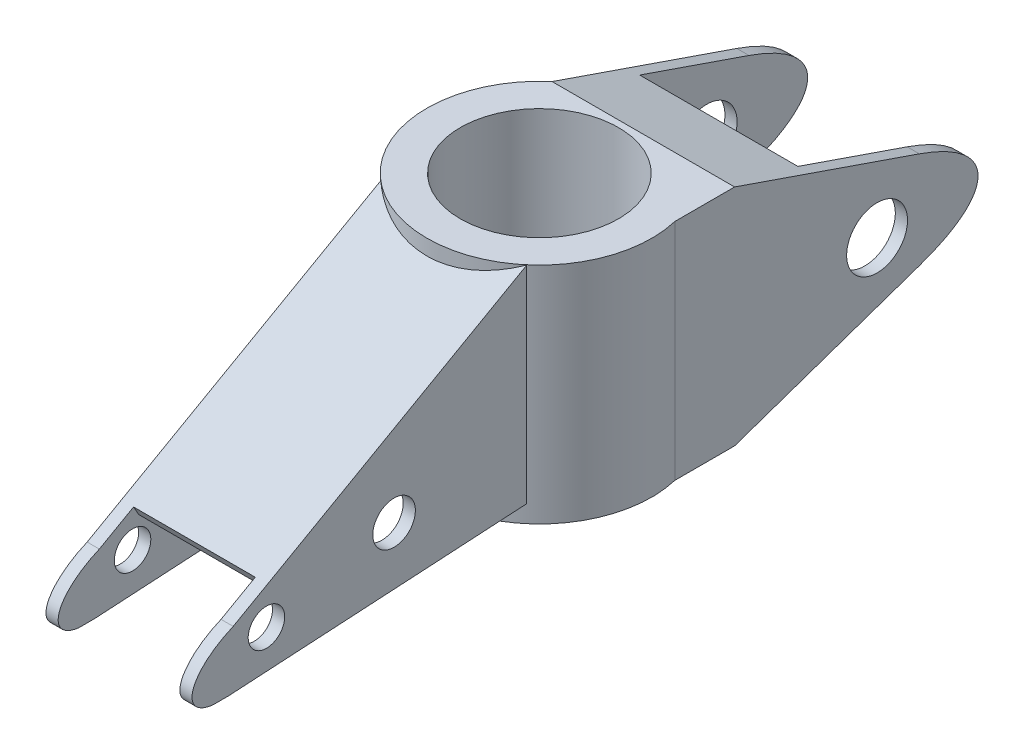
ISO-10303-21;
HEADER;
FILE_DESCRIPTION(('STEP AP214'),'2;1');
FILE_NAME('part.step','',(''),(''),'','','');
FILE_SCHEMA(('AUTOMOTIVE_DESIGN { 1 0 10303 214 1 1 1 1 }'));
ENDSEC;
DATA;
#1=APPLICATION_CONTEXT('core data for automotive mechanical design processes');
#2=APPLICATION_PROTOCOL_DEFINITION('international standard','automotive_design',2000,#1);
#3=PRODUCT_CONTEXT('',#1,'mechanical');
#4=PRODUCT('Part','Part','',(#3));
#5=PRODUCT_RELATED_PRODUCT_CATEGORY('part','',(#4));
#6=PRODUCT_DEFINITION_FORMATION('','',#4);
#7=PRODUCT_DEFINITION_CONTEXT('part definition',#1,'design');
#8=PRODUCT_DEFINITION('design','',#6,#7);
#9=PRODUCT_DEFINITION_SHAPE('','',#8);
#10=(LENGTH_UNIT() NAMED_UNIT(*) SI_UNIT(.MILLI.,.METRE.));
#11=(NAMED_UNIT(*) PLANE_ANGLE_UNIT() SI_UNIT($,.RADIAN.));
#12=(NAMED_UNIT(*) SI_UNIT($,.STERADIAN.) SOLID_ANGLE_UNIT());
#13=UNCERTAINTY_MEASURE_WITH_UNIT(LENGTH_MEASURE(1.E-05),#10,'distance_accuracy_value','');
#14=(GEOMETRIC_REPRESENTATION_CONTEXT(3) GLOBAL_UNCERTAINTY_ASSIGNED_CONTEXT((#13)) GLOBAL_UNIT_ASSIGNED_CONTEXT((#10,
#11,#12)) REPRESENTATION_CONTEXT('',''));
#15=CARTESIAN_POINT('',(0.,0.,0.));
#16=DIRECTION('',(0.,0.,1.));
#17=DIRECTION('',(1.,0.,0.));
#18=AXIS2_PLACEMENT_3D('',#15,#16,#17);
#19=CARTESIAN_POINT('',(4.00000000000001,-100.079968025574,0.));
#20=DIRECTION('',(-1.,0.,0.));
#21=DIRECTION('',(0.,0.,1.));
#22=AXIS2_PLACEMENT_3D('',#19,#20,#21);
#23=PLANE('',#22);
#24=CARTESIAN_POINT('',(4.,35.8147805236539,-103.144942625602));
#25=DIRECTION('',(-1.,0.,0.));
#26=DIRECTION('',(0.,0.,1.));
#27=AXIS2_PLACEMENT_3D('',#24,#25,#26);
#28=CIRCLE('',#27,9.99999999999999);
#29=CARTESIAN_POINT('',(4.,35.8147805236539,-93.1449426256023));
#30=VERTEX_POINT('',#29);
#31=EDGE_CURVE('E298',#30,#30,#28,.T.);
#32=ORIENTED_EDGE('',*,*,#31,.T.);
#33=EDGE_LOOP('',(#32));
#34=FACE_BOUND('',#33,.T.);
#35=DIRECTION('',(0.,-0.945410692070635,0.32588130249912));
#36=VECTOR('',#35,1.);
#37=CARTESIAN_POINT('',(4.,65.1499902046389,-81.1248515178503));
#38=LINE('',#37,#36);
#39=CARTESIAN_POINT('',(4.00000000000001,65.1499902046389,-81.1248515178503));
#40=VERTEX_POINT('',#39);
#41=CARTESIAN_POINT('',(4.,61.3683474363564,-79.8213263078538));
#42=VERTEX_POINT('',#41);
#43=EDGE_CURVE('E297',#40,#42,#38,.T.);
#44=ORIENTED_EDGE('',*,*,#43,.T.);
#45=DIRECTION('',(0.,0.325881302499121,0.945410692070635));
#46=VECTOR('',#45,1.);
#47=CARTESIAN_POINT('',(4.,61.3683474363564,-79.8213263078538));
#48=LINE('',#47,#46);
#49=CARTESIAN_POINT('',(4.00000000000001,68.4457949539171,-59.2890205132042));
#50=VERTEX_POINT('',#49);
#51=EDGE_CURVE('E274',#42,#50,#48,.T.);
#52=ORIENTED_EDGE('',*,*,#51,.T.);
#53=DIRECTION('',(0.,1.,0.));
#54=VECTOR('',#53,1.);
#55=CARTESIAN_POINT('',(4.,-100.079968025574,-59.2890205132042));
#56=LINE('',#55,#54);
#57=CARTESIAN_POINT('',(4.00000000000001,1.02323956880528,-59.2890205132042));
#58=VERTEX_POINT('',#57);
#59=EDGE_CURVE('E466',#58,#50,#56,.T.);
#60=ORIENTED_EDGE('',*,*,#59,.F.);
#61=DIRECTION('',(0.,0.325881302499121,-0.945410692070635));
#62=VECTOR('',#61,1.);
#63=CARTESIAN_POINT('',(4.00000000000002,-27.9802350987114,24.8526434840547));
#64=LINE('',#63,#62);
#65=CARTESIAN_POINT('',(4.,20.9264446672444,-117.029991726457));
#66=VERTEX_POINT('',#65);
#67=EDGE_CURVE('E458',#58,#66,#64,.T.);
#68=ORIENTED_EDGE('',*,*,#67,.T.);
#69=CARTESIAN_POINT('',(4.00000000000002,36.85,-68.1602556806574));
#70=DIRECTION('',(-1.,0.,0.));
#71=DIRECTION('',(0.,0.,-1.));
#72=AXIS2_PLACEMENT_3D('',#69,#70,#71);
#73=ELLIPSE('',#72,68.1602556806574,22.8428717685278);
#74=CARTESIAN_POINT('',(4.,52.7735553327556,-117.029991726457));
#75=VERTEX_POINT('',#74);
#76=EDGE_CURVE('E474',#75,#66,#73,.T.);
#77=ORIENTED_EDGE('',*,*,#76,.F.);
#78=DIRECTION('',(0.,-0.325881302499121,-0.945410692070635));
#79=VECTOR('',#78,1.);
#80=CARTESIAN_POINT('',(4.00000000000001,72.5966869079805,-59.5213209379844));
#81=LINE('',#80,#79);
#82=EDGE_CURVE('E476',#40,#75,#81,.T.);
#83=ORIENTED_EDGE('',*,*,#82,.F.);
#84=EDGE_LOOP('',(#44,#52,#60,#68,#77,#83));
#85=FACE_BOUND('',#84,.T.);
#86=ADVANCED_FACE('F92',(#34,#85),#23,.F.);
#87=CARTESIAN_POINT('',(56.,-100.079968025574,0.));
#88=DIRECTION('',(-1.,0.,0.));
#89=DIRECTION('',(0.,0.,1.));
#90=AXIS2_PLACEMENT_3D('',#87,#88,#89);
#91=PLANE('',#90);
#92=DIRECTION('',(0.,1.,0.));
#93=VECTOR('',#92,1.);
#94=CARTESIAN_POINT('',(56.,68.7,-58.244155034346));
#95=LINE('',#94,#93);
#96=CARTESIAN_POINT('',(56.,68.7,-58.244155034346));
#97=VERTEX_POINT('',#96);
#98=CARTESIAN_POINT('',(56.,68.8059581359527,-58.244155034346));
#99=VERTEX_POINT('',#98);
#100=EDGE_CURVE('E276',#97,#99,#95,.T.);
#101=ORIENTED_EDGE('',*,*,#100,.T.);
#102=DIRECTION('',(0.,0.325881302499121,0.945410692070635));
#103=VECTOR('',#102,1.);
#104=CARTESIAN_POINT('',(56.,61.3683474363564,-79.8213263078538));
#105=LINE('',#104,#103);
#106=CARTESIAN_POINT('',(56.,61.3683474363564,-79.8213263078538));
#107=VERTEX_POINT('',#106);
#108=EDGE_CURVE('E266',#107,#99,#105,.T.);
#109=ORIENTED_EDGE('',*,*,#108,.F.);
#110=DIRECTION('',(0.,-0.945410692070635,0.32588130249912));
#111=VECTOR('',#110,1.);
#112=CARTESIAN_POINT('',(56.,65.1499902046389,-81.1248515178503));
#113=LINE('',#112,#111);
#114=CARTESIAN_POINT('',(56.,65.1499902046389,-81.1248515178503));
#115=VERTEX_POINT('',#114);
#116=EDGE_CURVE('E288',#115,#107,#113,.T.);
#117=ORIENTED_EDGE('',*,*,#116,.F.);
#118=DIRECTION('',(0.,-0.325881302499121,-0.945410692070635));
#119=VECTOR('',#118,1.);
#120=CARTESIAN_POINT('',(56.,72.5966869079805,-59.5213209379844));
#121=LINE('',#120,#119);
#122=CARTESIAN_POINT('',(56.,52.7735553327556,-117.029991726457));
#123=VERTEX_POINT('',#122);
#124=EDGE_CURVE('E311',#115,#123,#121,.T.);
#125=ORIENTED_EDGE('',*,*,#124,.T.);
#126=CARTESIAN_POINT('',(56.,36.85,-68.1602556806574));
#127=DIRECTION('',(-1.,0.,0.));
#128=DIRECTION('',(0.,0.,-1.));
#129=AXIS2_PLACEMENT_3D('',#126,#127,#128);
#130=ELLIPSE('',#129,68.1602556806574,22.8428717685278);
#131=CARTESIAN_POINT('',(56.,20.9264446672444,-117.029991726457));
#132=VERTEX_POINT('',#131);
#133=EDGE_CURVE('E308',#123,#132,#130,.T.);
#134=ORIENTED_EDGE('',*,*,#133,.T.);
#135=DIRECTION('',(0.,0.325881302499121,-0.945410692070635));
#136=VECTOR('',#135,1.);
#137=CARTESIAN_POINT('',(56.,-27.9802350987114,24.8526434840547));
#138=LINE('',#137,#136);
#139=CARTESIAN_POINT('',(56.,0.,-56.3205113613149));
#140=VERTEX_POINT('',#139);
#141=EDGE_CURVE('E100',#140,#132,#138,.T.);
#142=ORIENTED_EDGE('',*,*,#141,.F.);
#143=DIRECTION('',(0.,0.,-1.));
#144=VECTOR('',#143,1.);
#145=CARTESIAN_POINT('',(56.,0.,0.));
#146=LINE('',#145,#144);
#147=CARTESIAN_POINT('',(56.,0.,-46.7344313016641));
#148=VERTEX_POINT('',#147);
#149=EDGE_CURVE('E457',#148,#140,#146,.T.);
#150=ORIENTED_EDGE('',*,*,#149,.F.);
#151=DIRECTION('',(0.,1.,0.));
#152=VECTOR('',#151,1.);
#153=CARTESIAN_POINT('',(56.,-100.079968025574,-46.7344313016641));
#154=LINE('',#153,#152);
#155=CARTESIAN_POINT('',(56.,68.7,-46.7344313016641));
#156=VERTEX_POINT('',#155);
#157=EDGE_CURVE('E313',#148,#156,#154,.T.);
#158=ORIENTED_EDGE('',*,*,#157,.T.);
#159=DIRECTION('',(0.,0.,-1.));
#160=VECTOR('',#159,1.);
#161=CARTESIAN_POINT('',(56.,68.7,-56.3205113613149));
#162=LINE('',#161,#160);
#163=EDGE_CURVE('E107',#156,#97,#162,.T.);
#164=ORIENTED_EDGE('',*,*,#163,.T.);
#165=EDGE_LOOP('',(#101,#109,#117,#125,#134,#142,#150,#158,#164));
#166=FACE_BOUND('',#165,.T.);
#167=CARTESIAN_POINT('',(56.,35.8147805236539,-103.144942625602));
#168=DIRECTION('',(-1.,0.,0.));
#169=DIRECTION('',(0.,0.,1.));
#170=AXIS2_PLACEMENT_3D('',#167,#168,#169);
#171=CIRCLE('',#170,9.99999999999999);
#172=CARTESIAN_POINT('',(56.,35.8147805236539,-93.1449426256023));
#173=VERTEX_POINT('',#172);
#174=EDGE_CURVE('E296',#173,#173,#171,.T.);
#175=ORIENTED_EDGE('',*,*,#174,.F.);
#176=EDGE_LOOP('',(#175));
#177=FACE_BOUND('',#176,.T.);
#178=ADVANCED_FACE('F277',(#166,#177),#91,.T.);
#179=CARTESIAN_POINT('',(24.,73.7,-28.1602556806574));
#180=DIRECTION('',(0.,-1.,0.));
#181=DIRECTION('',(0.,0.,-1.));
#182=AXIS2_PLACEMENT_3D('',#179,#180,#181);
#183=CYLINDRICAL_SURFACE('',#182,37.);
#184=CARTESIAN_POINT('',(24.,79.1758221409391,-28.1602556806574));
#185=DIRECTION('',(0.,0.945410692070635,-0.325881302499121));
#186=DIRECTION('',(0.,-0.325881302499121,-0.945410692070635));
#187=AXIS2_PLACEMENT_3D('',#184,#185,#186);
#188=ELLIPSE('',#187,39.136430664818,37.);
#189=CARTESIAN_POINT('',(45.5397075114109,68.8059581359527,-58.244155034346));
#190=VERTEX_POINT('',#189);
#191=EDGE_CURVE('E13',#190,#50,#188,.T.);
#192=ORIENTED_EDGE('',*,*,#191,.F.);
#193=DIRECTION('',(0.,1.,0.));
#194=VECTOR('',#193,1.);
#195=CARTESIAN_POINT('',(45.5397075114109,68.7,-58.244155034346));
#196=LINE('',#195,#194);
#197=CARTESIAN_POINT('',(45.5397075114109,68.7,-58.244155034346));
#198=VERTEX_POINT('',#197);
#199=EDGE_CURVE('E115',#198,#190,#196,.T.);
#200=ORIENTED_EDGE('',*,*,#199,.F.);
#201=CARTESIAN_POINT('',(24.,68.7,-28.1602556806574));
#202=DIRECTION('',(0.,-1.,0.));
#203=DIRECTION('',(0.,0.,1.));
#204=AXIS2_PLACEMENT_3D('',#201,#202,#203);
#205=CIRCLE('',#204,37.);
#206=EDGE_CURVE('E916',#198,#156,#205,.T.);
#207=ORIENTED_EDGE('',*,*,#206,.T.);
#208=ORIENTED_EDGE('',*,*,#157,.F.);
#209=CARTESIAN_POINT('',(24.,0.,-28.1602556806574));
#210=DIRECTION('',(0.,1.,0.));
#211=DIRECTION('',(0.,0.,1.));
#212=AXIS2_PLACEMENT_3D('',#209,#210,#211);
#213=CIRCLE('',#212,37.);
#214=CARTESIAN_POINT('',(48.,0.,-56.3205113613149));
#215=VERTEX_POINT('',#214);
#216=EDGE_CURVE('E310',#148,#215,#213,.T.);
#217=ORIENTED_EDGE('',*,*,#216,.T.);
#218=CARTESIAN_POINT('',(24.,-9.70678761821669,-28.1602556806574));
#219=DIRECTION('',(0.,0.945410692070635,0.325881302499121));
#220=DIRECTION('',(0.,-0.325881302499121,0.945410692070635));
#221=AXIS2_PLACEMENT_3D('',#218,#219,#220);
#222=ELLIPSE('',#221,39.136430664818,37.);
#223=EDGE_CURVE('E470',#215,#58,#222,.T.);
#224=ORIENTED_EDGE('',*,*,#223,.T.);
#225=ORIENTED_EDGE('',*,*,#59,.T.);
#226=EDGE_LOOP('',(#192,#200,#207,#208,#217,#224,#225));
#227=FACE_BOUND('',#226,.T.);
#228=ADVANCED_FACE('F517',(#227),#183,.T.);
#229=CARTESIAN_POINT('',(0.,-100.079968025574,0.));
#230=DIRECTION('',(1.,0.,0.));
#231=DIRECTION('',(0.,0.,-1.));
#232=AXIS2_PLACEMENT_3D('',#229,#230,#231);
#233=PLANE('',#232);
#234=CARTESIAN_POINT('',(0.,35.8147805236539,-103.144942625602));
#235=DIRECTION('',(1.,0.,0.));
#236=DIRECTION('',(0.,0.,-1.));
#237=AXIS2_PLACEMENT_3D('',#234,#235,#236);
#238=CIRCLE('',#237,9.99999999999999);
#239=CARTESIAN_POINT('',(0.,35.8147805236539,-113.144942625602));
#240=VERTEX_POINT('',#239);
#241=EDGE_CURVE('E301',#240,#240,#238,.T.);
#242=ORIENTED_EDGE('',*,*,#241,.T.);
#243=EDGE_LOOP('',(#242));
#244=FACE_BOUND('',#243,.T.);
#245=CARTESIAN_POINT('',(0.,36.85,-68.1602556806574));
#246=DIRECTION('',(-1.,0.,0.));
#247=DIRECTION('',(0.,0.,-1.));
#248=AXIS2_PLACEMENT_3D('',#245,#246,#247);
#249=ELLIPSE('',#248,68.1602556806574,22.8428717685278);
#250=CARTESIAN_POINT('',(0.,52.7735553327556,-117.029991726457));
#251=VERTEX_POINT('',#250);
#252=CARTESIAN_POINT('',(0.,20.9264446672444,-117.029991726457));
#253=VERTEX_POINT('',#252);
#254=EDGE_CURVE('E304',#251,#253,#249,.T.);
#255=ORIENTED_EDGE('',*,*,#254,.T.);
#256=DIRECTION('',(0.,0.325881302499121,-0.945410692070635));
#257=VECTOR('',#256,1.);
#258=CARTESIAN_POINT('',(0.,-17.3518802726336,-5.9811607711669));
#259=LINE('',#258,#257);
#260=CARTESIAN_POINT('',(0.,0.,-56.3205113613149));
#261=VERTEX_POINT('',#260);
#262=EDGE_CURVE('E858',#261,#253,#259,.T.);
#263=ORIENTED_EDGE('',*,*,#262,.F.);
#264=DIRECTION('',(0.,1.,0.));
#265=VECTOR('',#264,1.);
#266=CARTESIAN_POINT('',(0.,-100.079968025574,-56.3205113613149));
#267=LINE('',#266,#265);
#268=CARTESIAN_POINT('',(0.,73.7,-56.3205113613149));
#269=VERTEX_POINT('',#268);
#270=EDGE_CURVE('E462',#261,#269,#267,.T.);
#271=ORIENTED_EDGE('',*,*,#270,.T.);
#272=DIRECTION('',(0.,-0.325881302499121,-0.945410692070635));
#273=VECTOR('',#272,1.);
#274=CARTESIAN_POINT('',(0.,83.2250417340584,-28.6875166827628));
#275=LINE('',#274,#273);
#276=EDGE_CURVE('E465',#269,#251,#275,.T.);
#277=ORIENTED_EDGE('',*,*,#276,.T.);
#278=EDGE_LOOP('',(#255,#263,#271,#277));
#279=FACE_BOUND('',#278,.T.);
#280=ADVANCED_FACE('F498',(#244,#279),#233,.F.);
#281=CARTESIAN_POINT('',(24.,0.,-28.1602556806574));
#282=DIRECTION('',(0.,1.,0.));
#283=DIRECTION('',(0.,0.,1.));
#284=AXIS2_PLACEMENT_3D('',#281,#282,#283);
#285=PLANE('',#284);
#286=CARTESIAN_POINT('',(24.,0.,-28.1602556806574));
#287=DIRECTION('',(0.,1.,0.));
#288=DIRECTION('',(0.,0.,1.));
#289=AXIS2_PLACEMENT_3D('',#286,#287,#288);
#290=CIRCLE('',#289,26.);
#291=CARTESIAN_POINT('',(24.,0.,-2.16025568065744));
#292=VERTEX_POINT('',#291);
#293=EDGE_CURVE('E454',#292,#292,#290,.T.);
#294=ORIENTED_EDGE('',*,*,#293,.T.);
#295=EDGE_LOOP('',(#294));
#296=FACE_BOUND('',#295,.T.);
#297=CARTESIAN_POINT('',(60.,0.,-36.7042594259749));
#298=VERTEX_POINT('',#297);
#299=EDGE_CURVE('E446',#261,#298,#213,.T.);
#300=ORIENTED_EDGE('',*,*,#299,.F.);
#301=DIRECTION('',(-1.,0.,0.));
#302=VECTOR('',#301,1.);
#303=CARTESIAN_POINT('',(76.,0.,-56.3205113613149));
#304=LINE('',#303,#302);
#305=EDGE_CURVE('E887',#215,#261,#304,.T.);
#306=ORIENTED_EDGE('',*,*,#305,.F.);
#307=ORIENTED_EDGE('',*,*,#216,.F.);
#308=ORIENTED_EDGE('',*,*,#149,.T.);
#309=CARTESIAN_POINT('',(60.,0.,-56.3205113613149));
#310=VERTEX_POINT('',#309);
#311=EDGE_CURVE('E307',#310,#140,#304,.T.);
#312=ORIENTED_EDGE('',*,*,#311,.F.);
#313=DIRECTION('',(0.,0.,1.));
#314=VECTOR('',#313,1.);
#315=CARTESIAN_POINT('',(60.,0.,0.));
#316=LINE('',#315,#314);
#317=EDGE_CURVE('E868',#310,#298,#316,.T.);
#318=ORIENTED_EDGE('',*,*,#317,.T.);
#319=EDGE_LOOP('',(#300,#306,#307,#308,#312,#318));
#320=FACE_BOUND('',#319,.T.);
#321=ADVANCED_FACE('F94',(#296,#320),#285,.F.);
#322=CARTESIAN_POINT('',(60.,-100.079968025574,0.));
#323=DIRECTION('',(1.,0.,0.));
#324=DIRECTION('',(0.,0.,-1.));
#325=AXIS2_PLACEMENT_3D('',#322,#323,#324);
#326=PLANE('',#325);
#327=CARTESIAN_POINT('',(60.,35.8147805236539,-103.144942625602));
#328=DIRECTION('',(1.,0.,0.));
#329=DIRECTION('',(0.,0.,-1.));
#330=AXIS2_PLACEMENT_3D('',#327,#328,#329);
#331=CIRCLE('',#330,9.99999999999999);
#332=CARTESIAN_POINT('',(60.,35.8147805236539,-113.144942625602));
#333=VERTEX_POINT('',#332);
#334=EDGE_CURVE('E293',#333,#333,#331,.T.);
#335=ORIENTED_EDGE('',*,*,#334,.F.);
#336=EDGE_LOOP('',(#335));
#337=FACE_BOUND('',#336,.T.);
#338=DIRECTION('',(0.,-0.325881302499121,0.945410692070635));
#339=VECTOR('',#338,1.);
#340=CARTESIAN_POINT('',(60.,-27.9802350987114,24.8526434840547));
#341=LINE('',#340,#339);
#342=CARTESIAN_POINT('',(60.,20.9264446672444,-117.029991726457));
#343=VERTEX_POINT('',#342);
#344=EDGE_CURVE('E890',#343,#310,#341,.T.);
#345=ORIENTED_EDGE('',*,*,#344,.F.);
#346=CARTESIAN_POINT('',(60.,36.85,-68.1602556806574));
#347=DIRECTION('',(-1.,0.,0.));
#348=DIRECTION('',(0.,0.,-1.));
#349=AXIS2_PLACEMENT_3D('',#346,#347,#348);
#350=ELLIPSE('',#349,68.1602556806574,22.8428717685278);
#351=CARTESIAN_POINT('',(60.,52.7735553327556,-117.029991726457));
#352=VERTEX_POINT('',#351);
#353=EDGE_CURVE('E480',#343,#352,#350,.F.);
#354=ORIENTED_EDGE('',*,*,#353,.T.);
#355=DIRECTION('',(0.,0.325881302499121,0.945410692070635));
#356=VECTOR('',#355,1.);
#357=CARTESIAN_POINT('',(60.,72.5966869079805,-59.5213209379844));
#358=LINE('',#357,#356);
#359=CARTESIAN_POINT('',(60.,73.7,-56.3205113613149));
#360=VERTEX_POINT('',#359);
#361=EDGE_CURVE('E472',#352,#360,#358,.T.);
#362=ORIENTED_EDGE('',*,*,#361,.T.);
#363=DIRECTION('',(0.,0.,-1.));
#364=VECTOR('',#363,1.);
#365=CARTESIAN_POINT('',(60.,73.7,0.));
#366=LINE('',#365,#364);
#367=CARTESIAN_POINT('',(60.,73.7,-36.7042594259749));
#368=VERTEX_POINT('',#367);
#369=EDGE_CURVE('E469',#368,#360,#366,.T.);
#370=ORIENTED_EDGE('',*,*,#369,.F.);
#371=DIRECTION('',(0.,1.,0.));
#372=VECTOR('',#371,1.);
#373=CARTESIAN_POINT('',(60.,-100.079968025574,-36.7042594259749));
#374=LINE('',#373,#372);
#375=EDGE_CURVE('E421',#298,#368,#374,.T.);
#376=ORIENTED_EDGE('',*,*,#375,.F.);
#377=ORIENTED_EDGE('',*,*,#317,.F.);
#378=EDGE_LOOP('',(#345,#354,#362,#370,#376,#377));
#379=FACE_BOUND('',#378,.T.);
#380=ADVANCED_FACE('F514',(#337,#379),#326,.T.);
#381=CARTESIAN_POINT('',(24.,73.7,-28.1602556806574));
#382=DIRECTION('',(0.,1.,0.));
#383=DIRECTION('',(0.,0.,1.));
#384=AXIS2_PLACEMENT_3D('',#381,#382,#383);
#385=PLANE('',#384);
#386=DIRECTION('',(-1.,0.,0.));
#387=VECTOR('',#386,1.);
#388=CARTESIAN_POINT('',(76.,73.7,-56.3205113613149));
#389=LINE('',#388,#387);
#390=EDGE_CURVE('E453',#360,#269,#389,.T.);
#391=ORIENTED_EDGE('',*,*,#390,.T.);
#392=CARTESIAN_POINT('',(24.,73.7,-28.1602556806574));
#393=DIRECTION('',(0.,1.,0.));
#394=DIRECTION('',(0.,0.,1.));
#395=AXIS2_PLACEMENT_3D('',#392,#393,#394);
#396=CIRCLE('',#395,37.);
#397=EDGE_CURVE('E440',#269,#368,#396,.T.);
#398=ORIENTED_EDGE('',*,*,#397,.T.);
#399=ORIENTED_EDGE('',*,*,#369,.T.);
#400=EDGE_LOOP('',(#391,#398,#399));
#401=FACE_BOUND('',#400,.T.);
#402=CARTESIAN_POINT('',(24.,73.7,-28.1602556806574));
#403=DIRECTION('',(0.,1.,0.));
#404=DIRECTION('',(0.,0.,1.));
#405=AXIS2_PLACEMENT_3D('',#402,#403,#404);
#406=CIRCLE('',#405,26.);
#407=CARTESIAN_POINT('',(24.,73.7,-2.16025568065744));
#408=VERTEX_POINT('',#407);
#409=EDGE_CURVE('E433',#408,#408,#406,.T.);
#410=ORIENTED_EDGE('',*,*,#409,.F.);
#411=EDGE_LOOP('',(#410));
#412=FACE_BOUND('',#411,.T.);
#413=ADVANCED_FACE('F510',(#401,#412),#385,.T.);
#414=DIRECTION('',(0.,-1.,0.));
#415=VECTOR('',#414,1.);
#416=CARTESIAN_POINT('',(4.,73.7,2.96850915188929));
#417=LINE('',#416,#415);
#418=CARTESIAN_POINT('',(4.,67.9400447519825,2.96850915188933));
#419=VERTEX_POINT('',#418);
#420=CARTESIAN_POINT('',(4.00000000000001,5.53645253708714,2.96850915188922));
#421=VERTEX_POINT('',#420);
#422=EDGE_CURVE('E437',#419,#421,#417,.T.);
#423=ORIENTED_EDGE('',*,*,#422,.T.);
#424=CARTESIAN_POINT('',(24.,7.34868602794372,-28.1602556806574));
#425=DIRECTION('',(0.,0.998309666919394,0.0581189206307865));
#426=DIRECTION('',(0.,-0.0581189206307866,0.998309666919395));
#427=AXIS2_PLACEMENT_3D('',#424,#425,#426);
#428=ELLIPSE('',#427,37.0626482203417,37.);
#429=CARTESIAN_POINT('',(0.,5.70927120599056,0.));
#430=VERTEX_POINT('',#429);
#431=EDGE_CURVE('E434',#421,#430,#428,.F.);
#432=ORIENTED_EDGE('',*,*,#431,.T.);
#433=DIRECTION('',(0.,-1.,0.));
#434=VECTOR('',#433,1.);
#435=CARTESIAN_POINT('',(0.,0.,0.));
#436=LINE('',#435,#434);
#437=CARTESIAN_POINT('',(0.,73.62,0.));
#438=VERTEX_POINT('',#437);
#439=EDGE_CURVE('E329',#438,#430,#436,.T.);
#440=ORIENTED_EDGE('',*,*,#439,.F.);
#441=CARTESIAN_POINT('',(24.,89.5566088819785,-28.1602556806574));
#442=DIRECTION('',(0.,-0.870298697625102,-0.492524290682248));
#443=DIRECTION('',(0.,-0.492524290682248,0.870298697625102));
#444=AXIS2_PLACEMENT_3D('',#441,#442,#443);
#445=ELLIPSE('',#444,42.514139227103,37.);
#446=CARTESIAN_POINT('',(48.,73.62,0.));
#447=VERTEX_POINT('',#446);
#448=EDGE_CURVE('E318',#438,#447,#445,.F.);
#449=ORIENTED_EDGE('',*,*,#448,.T.);
#450=DIRECTION('',(0.,1.,0.));
#451=VECTOR('',#450,1.);
#452=CARTESIAN_POINT('',(48.,73.62,0.));
#453=LINE('',#452,#451);
#454=CARTESIAN_POINT('',(48.,5.70927120599057,0.));
#455=VERTEX_POINT('',#454);
#456=EDGE_CURVE('E569',#455,#447,#453,.T.);
#457=ORIENTED_EDGE('',*,*,#456,.F.);
#458=CARTESIAN_POINT('',(24.,7.34868602794372,-28.1602556806574));
#459=DIRECTION('',(0.,0.998309666919394,0.0581189206307865));
#460=DIRECTION('',(0.,-0.0581189206307866,0.998309666919395));
#461=AXIS2_PLACEMENT_3D('',#458,#459,#460);
#462=ELLIPSE('',#461,37.0626482203417,37.);
#463=CARTESIAN_POINT('',(44.,5.53645253708716,2.96850915188925));
#464=VERTEX_POINT('',#463);
#465=EDGE_CURVE('E314',#455,#464,#462,.F.);
#466=ORIENTED_EDGE('',*,*,#465,.T.);
#467=DIRECTION('',(0.,-1.,0.));
#468=VECTOR('',#467,1.);
#469=CARTESIAN_POINT('',(44.,73.7,2.96850915188929));
#470=LINE('',#469,#468);
#471=CARTESIAN_POINT('',(44.,67.9400447519826,2.96850915188929));
#472=VERTEX_POINT('',#471);
#473=EDGE_CURVE('E317',#464,#472,#470,.F.);
#474=ORIENTED_EDGE('',*,*,#473,.T.);
#475=CARTESIAN_POINT('',(24.,85.5566088819786,-28.1602556806574));
#476=DIRECTION('',(0.,0.870298697625101,0.492524290682249));
#477=DIRECTION('',(0.,-0.492524290682249,0.870298697625101));
#478=AXIS2_PLACEMENT_3D('',#475,#476,#477);
#479=ELLIPSE('',#478,42.514139227103,37.);
#480=EDGE_CURVE('E443',#472,#419,#479,.F.);
#481=ORIENTED_EDGE('',*,*,#480,.T.);
#482=EDGE_LOOP('',(#423,#432,#440,#449,#457,#466,#474,#481));
#483=FACE_BOUND('',#482,.T.);
#484=ORIENTED_EDGE('',*,*,#299,.T.);
#485=ORIENTED_EDGE('',*,*,#375,.T.);
#486=ORIENTED_EDGE('',*,*,#397,.F.);
#487=ORIENTED_EDGE('',*,*,#270,.F.);
#488=EDGE_LOOP('',(#484,#485,#486,#487));
#489=FACE_BOUND('',#488,.T.);
#490=ADVANCED_FACE('F513',(#483,#489),#183,.T.);
#491=CARTESIAN_POINT('',(4.,73.62,110.));
#492=DIRECTION('',(-1.,0.,0.));
#493=DIRECTION('',(0.,-1.,0.));
#494=AXIS2_PLACEMENT_3D('',#491,#492,#493);
#495=PLANE('',#494);
#496=CARTESIAN_POINT('',(4.00000000000001,13.3225136906807,85.5494254000948));
#497=DIRECTION('',(-1.,0.,0.));
#498=DIRECTION('',(0.,-1.,0.));
#499=AXIS2_PLACEMENT_3D('',#496,#497,#498);
#500=CIRCLE('',#499,6.);
#501=CARTESIAN_POINT('',(4.00000000000001,7.32251369068067,85.5494254000948));
#502=VERTEX_POINT('',#501);
#503=EDGE_CURVE('E412',#502,#502,#500,.T.);
#504=ORIENTED_EDGE('',*,*,#503,.T.);
#505=EDGE_LOOP('',(#504));
#506=FACE_BOUND('',#505,.T.);
#507=CARTESIAN_POINT('',(4.,22.1107045592011,43.5962761348961));
#508=DIRECTION('',(-1.,0.,0.));
#509=DIRECTION('',(0.,-1.,0.));
#510=AXIS2_PLACEMENT_3D('',#507,#508,#509);
#511=CIRCLE('',#510,7.);
#512=CARTESIAN_POINT('',(4.,15.1107045592011,43.5962761348961));
#513=VERTEX_POINT('',#512);
#514=EDGE_CURVE('E344',#513,#513,#511,.T.);
#515=ORIENTED_EDGE('',*,*,#514,.T.);
#516=EDGE_LOOP('',(#515));
#517=FACE_BOUND('',#516,.T.);
#518=ORIENTED_EDGE('',*,*,#422,.F.);
#519=DIRECTION('',(0.,0.492524290682249,-0.870298697625101));
#520=VECTOR('',#519,1.);
#521=CARTESIAN_POINT('',(4.00000000000001,22.3615147565386,83.5065375194943));
#522=LINE('',#521,#520);
#523=CARTESIAN_POINT('',(4.00000000000001,22.3615147565386,83.5065375194943));
#524=VERTEX_POINT('',#523);
#525=EDGE_CURVE('E598',#524,#419,#522,.T.);
#526=ORIENTED_EDGE('',*,*,#525,.F.);
#527=DIRECTION('',(0.,-0.870298697625101,-0.492524290682249));
#528=VECTOR('',#527,1.);
#529=CARTESIAN_POINT('',(4.00000000000001,25.3911940488904,85.2211105144123));
#530=LINE('',#529,#528);
#531=CARTESIAN_POINT('',(4.00000000000001,25.3911940488904,85.2211105144123));
#532=VERTEX_POINT('',#531);
#533=EDGE_CURVE('E602',#532,#524,#530,.T.);
#534=ORIENTED_EDGE('',*,*,#533,.F.);
#535=DIRECTION('',(0.,-0.492524290682248,0.870298697625102));
#536=VECTOR('',#535,1.);
#537=CARTESIAN_POINT('',(4.00000000000001,26.4692426397564,83.3161805396743));
#538=LINE('',#537,#536);
#539=CARTESIAN_POINT('',(4.00000000000001,19.0257392652668,96.4689760771549));
#540=VERTEX_POINT('',#539);
#541=EDGE_CURVE('E323',#532,#540,#538,.T.);
#542=ORIENTED_EDGE('',*,*,#541,.T.);
#543=CARTESIAN_POINT('',(4.00000000000001,10.6944038420479,93.0067729624214));
#544=DIRECTION('',(1.,0.,0.));
#545=DIRECTION('',(0.,0.383747602122532,-0.923438020586767));
#546=AXIS2_PLACEMENT_3D('',#543,#544,#545);
#547=ELLIPSE('',#546,18.0161457872116,9.02208403540185);
#548=CARTESIAN_POINT('',(4.00000000000001,0.,103.206442296671));
#549=VERTEX_POINT('',#548);
#550=EDGE_CURVE('E338',#549,#540,#547,.F.);
#551=ORIENTED_EDGE('',*,*,#550,.F.);
#552=DIRECTION('',(0.,0.,-1.));
#553=VECTOR('',#552,1.);
#554=CARTESIAN_POINT('',(4.00000000000001,0.,110.));
#555=LINE('',#554,#553);
#556=CARTESIAN_POINT('',(4.00000000000001,0.,98.0682465218693));
#557=VERTEX_POINT('',#556);
#558=EDGE_CURVE('E319',#549,#557,#555,.T.);
#559=ORIENTED_EDGE('',*,*,#558,.T.);
#560=DIRECTION('',(0.,0.0581189206307866,-0.998309666919395));
#561=VECTOR('',#560,1.);
#562=CARTESIAN_POINT('',(4.00000000000001,-0.443614160117026,105.68821433305));
#563=LINE('',#562,#561);
#564=EDGE_CURVE('E322',#557,#421,#563,.T.);
#565=ORIENTED_EDGE('',*,*,#564,.T.);
#566=EDGE_LOOP('',(#518,#526,#534,#542,#551,#559,#565));
#567=FACE_BOUND('',#566,.T.);
#568=ADVANCED_FACE('F384',(#506,#517,#567),#495,.F.);
#569=CARTESIAN_POINT('',(44.,0.,110.));
#570=DIRECTION('',(1.,0.,0.));
#571=DIRECTION('',(0.,0.,-1.));
#572=AXIS2_PLACEMENT_3D('',#569,#570,#571);
#573=PLANE('',#572);
#574=CARTESIAN_POINT('',(44.,13.3225136906807,85.5494254000948));
#575=DIRECTION('',(1.,0.,0.));
#576=DIRECTION('',(0.,0.,-1.));
#577=AXIS2_PLACEMENT_3D('',#574,#575,#576);
#578=CIRCLE('',#577,6.);
#579=CARTESIAN_POINT('',(44.,13.3225136906807,79.5494254000948));
#580=VERTEX_POINT('',#579);
#581=EDGE_CURVE('E349',#580,#580,#578,.T.);
#582=ORIENTED_EDGE('',*,*,#581,.T.);
#583=EDGE_LOOP('',(#582));
#584=FACE_BOUND('',#583,.T.);
#585=CARTESIAN_POINT('',(44.,22.1107045592011,43.5962761348961));
#586=DIRECTION('',(1.,0.,0.));
#587=DIRECTION('',(0.,0.,-1.));
#588=AXIS2_PLACEMENT_3D('',#585,#586,#587);
#589=CIRCLE('',#588,7.);
#590=CARTESIAN_POINT('',(44.,22.1107045592011,36.5962761348961));
#591=VERTEX_POINT('',#590);
#592=EDGE_CURVE('E415',#591,#591,#589,.T.);
#593=ORIENTED_EDGE('',*,*,#592,.T.);
#594=EDGE_LOOP('',(#593));
#595=FACE_BOUND('',#594,.T.);
#596=ORIENTED_EDGE('',*,*,#473,.F.);
#597=DIRECTION('',(0.,-0.0581189206307866,0.998309666919395));
#598=VECTOR('',#597,1.);
#599=CARTESIAN_POINT('',(44.,-0.692288453932882,109.959696816488));
#600=LINE('',#599,#598);
#601=CARTESIAN_POINT('',(44.,0.,98.0682465218694));
#602=VERTEX_POINT('',#601);
#603=EDGE_CURVE('E418',#464,#602,#600,.T.);
#604=ORIENTED_EDGE('',*,*,#603,.T.);
#605=DIRECTION('',(0.,0.,-1.));
#606=VECTOR('',#605,1.);
#607=CARTESIAN_POINT('',(44.,0.,110.));
#608=LINE('',#607,#606);
#609=CARTESIAN_POINT('',(44.,0.,103.206442296671));
#610=VERTEX_POINT('',#609);
#611=EDGE_CURVE('E590',#610,#602,#608,.T.);
#612=ORIENTED_EDGE('',*,*,#611,.F.);
#613=CARTESIAN_POINT('',(44.,10.6944038420479,93.0067729624214));
#614=DIRECTION('',(1.,0.,0.));
#615=DIRECTION('',(0.,0.383747602122532,-0.923438020586767));
#616=AXIS2_PLACEMENT_3D('',#613,#614,#615);
#617=ELLIPSE('',#616,18.0161457872116,9.02208403540185);
#618=CARTESIAN_POINT('',(44.,19.0257392652669,96.4689760771549));
#619=VERTEX_POINT('',#618);
#620=EDGE_CURVE('E430',#619,#610,#617,.T.);
#621=ORIENTED_EDGE('',*,*,#620,.F.);
#622=DIRECTION('',(0.,0.492524290682248,-0.870298697625102));
#623=VECTOR('',#622,1.);
#624=CARTESIAN_POINT('',(44.,8.6104900154911,114.872896511139));
#625=LINE('',#624,#623);
#626=CARTESIAN_POINT('',(44.,25.3911940488905,85.2211105144123));
#627=VERTEX_POINT('',#626);
#628=EDGE_CURVE('E587',#619,#627,#625,.T.);
#629=ORIENTED_EDGE('',*,*,#628,.T.);
#630=DIRECTION('',(0.,-0.870298697625101,-0.492524290682249));
#631=VECTOR('',#630,1.);
#632=CARTESIAN_POINT('',(44.,25.3911940488905,85.2211105144123));
#633=LINE('',#632,#631);
#634=CARTESIAN_POINT('',(44.,22.3615147565386,83.5065375194943));
#635=VERTEX_POINT('',#634);
#636=EDGE_CURVE('E593',#627,#635,#633,.T.);
#637=ORIENTED_EDGE('',*,*,#636,.T.);
#638=DIRECTION('',(0.,0.492524290682249,-0.870298697625101));
#639=VECTOR('',#638,1.);
#640=CARTESIAN_POINT('',(44.,22.3615147565386,83.5065375194943));
#641=LINE('',#640,#639);
#642=EDGE_CURVE('E328',#635,#472,#641,.T.);
#643=ORIENTED_EDGE('',*,*,#642,.T.);
#644=EDGE_LOOP('',(#596,#604,#612,#621,#629,#637,#643));
#645=FACE_BOUND('',#644,.T.);
#646=ADVANCED_FACE('F380',(#584,#595,#645),#573,.F.);
#647=CARTESIAN_POINT('',(4.00000000000001,0.,110.));
#648=DIRECTION('',(0.,1.,0.));
#649=DIRECTION('',(-1.,0.,0.));
#650=AXIS2_PLACEMENT_3D('',#647,#648,#649);
#651=PLANE('',#650);
#652=DIRECTION('',(0.,0.,-1.));
#653=VECTOR('',#652,1.);
#654=CARTESIAN_POINT('',(0.,0.,110.));
#655=LINE('',#654,#653);
#656=CARTESIAN_POINT('',(0.,0.,103.206442296671));
#657=VERTEX_POINT('',#656);
#658=CARTESIAN_POINT('',(0.,0.,98.0682465218692));
#659=VERTEX_POINT('',#658);
#660=EDGE_CURVE('E324',#657,#659,#655,.T.);
#661=ORIENTED_EDGE('',*,*,#660,.T.);
#662=DIRECTION('',(1.,0.,0.));
#663=VECTOR('',#662,1.);
#664=CARTESIAN_POINT('',(4.00000000000006,0.,98.0682465218693));
#665=LINE('',#664,#663);
#666=EDGE_CURVE('E327',#659,#557,#665,.T.);
#667=ORIENTED_EDGE('',*,*,#666,.T.);
#668=ORIENTED_EDGE('',*,*,#558,.F.);
#669=DIRECTION('',(1.,0.,0.));
#670=VECTOR('',#669,1.);
#671=CARTESIAN_POINT('',(-62.,0.,103.206442296671));
#672=LINE('',#671,#670);
#673=EDGE_CURVE('E334',#657,#549,#672,.T.);
#674=ORIENTED_EDGE('',*,*,#673,.F.);
#675=EDGE_LOOP('',(#661,#667,#668,#674));
#676=FACE_BOUND('',#675,.T.);
#677=ADVANCED_FACE('F383',(#676),#651,.F.);
#678=CARTESIAN_POINT('',(0.,0.,110.));
#679=DIRECTION('',(1.,0.,0.));
#680=DIRECTION('',(0.,0.,-1.));
#681=AXIS2_PLACEMENT_3D('',#678,#679,#680);
#682=PLANE('',#681);
#683=CARTESIAN_POINT('',(0.,22.1107045592011,43.5962761348961));
#684=DIRECTION('',(1.,0.,0.));
#685=DIRECTION('',(0.,0.,-1.));
#686=AXIS2_PLACEMENT_3D('',#683,#684,#685);
#687=CIRCLE('',#686,7.);
#688=CARTESIAN_POINT('',(0.,22.1107045592011,36.5962761348961));
#689=VERTEX_POINT('',#688);
#690=EDGE_CURVE('E352',#689,#689,#687,.T.);
#691=ORIENTED_EDGE('',*,*,#690,.T.);
#692=EDGE_LOOP('',(#691));
#693=FACE_BOUND('',#692,.T.);
#694=CARTESIAN_POINT('',(0.,13.3225136906807,85.5494254000948));
#695=DIRECTION('',(1.,0.,0.));
#696=DIRECTION('',(0.,0.,-1.));
#697=AXIS2_PLACEMENT_3D('',#694,#695,#696);
#698=CIRCLE('',#697,6.);
#699=CARTESIAN_POINT('',(0.,13.3225136906807,79.5494254000948));
#700=VERTEX_POINT('',#699);
#701=EDGE_CURVE('E333',#700,#700,#698,.T.);
#702=ORIENTED_EDGE('',*,*,#701,.T.);
#703=EDGE_LOOP('',(#702));
#704=FACE_BOUND('',#703,.T.);
#705=ORIENTED_EDGE('',*,*,#439,.T.);
#706=DIRECTION('',(0.,-0.0581189206307866,0.998309666919395));
#707=VECTOR('',#706,1.);
#708=CARTESIAN_POINT('',(0.,-0.69228845393289,109.959696816488));
#709=LINE('',#708,#707);
#710=EDGE_CURVE('E332',#430,#659,#709,.T.);
#711=ORIENTED_EDGE('',*,*,#710,.T.);
#712=ORIENTED_EDGE('',*,*,#660,.F.);
#713=CARTESIAN_POINT('',(0.,10.6944038420479,93.0067729624214));
#714=DIRECTION('',(1.,0.,0.));
#715=DIRECTION('',(0.,0.383747602122532,-0.923438020586767));
#716=AXIS2_PLACEMENT_3D('',#713,#714,#715);
#717=ELLIPSE('',#716,18.0161457872116,9.02208403540185);
#718=CARTESIAN_POINT('',(0.,19.0257392652668,96.4689760771549));
#719=VERTEX_POINT('',#718);
#720=EDGE_CURVE('E337',#719,#657,#717,.T.);
#721=ORIENTED_EDGE('',*,*,#720,.F.);
#722=DIRECTION('',(0.,0.492524290682248,-0.870298697625102));
#723=VECTOR('',#722,1.);
#724=CARTESIAN_POINT('',(0.,8.6104900154911,114.872896511139));
#725=LINE('',#724,#723);
#726=EDGE_CURVE('E341',#719,#438,#725,.T.);
#727=ORIENTED_EDGE('',*,*,#726,.T.);
#728=EDGE_LOOP('',(#705,#711,#712,#721,#727));
#729=FACE_BOUND('',#728,.T.);
#730=ADVANCED_FACE('F623',(#693,#704,#729),#682,.F.);
#731=CARTESIAN_POINT('',(-62.,5.70927120599055,0.));
#732=DIRECTION('',(0.,0.998309666919394,0.0581189206307865));
#733=DIRECTION('',(0.,-0.0581189206307866,0.998309666919395));
#734=AXIS2_PLACEMENT_3D('',#731,#732,#733);
#735=PLANE('',#734);
#736=ORIENTED_EDGE('',*,*,#431,.F.);
#737=ORIENTED_EDGE('',*,*,#564,.F.);
#738=ORIENTED_EDGE('',*,*,#666,.F.);
#739=ORIENTED_EDGE('',*,*,#710,.F.);
#740=EDGE_LOOP('',(#736,#737,#738,#739));
#741=FACE_BOUND('',#740,.T.);
#742=ADVANCED_FACE('F368',(#741),#735,.F.);
#743=CARTESIAN_POINT('',(-62.,10.6944038420479,93.0067729624214));
#744=DIRECTION('',(1.,0.,0.));
#745=DIRECTION('',(0.,0.383747602122532,-0.923438020586767));
#746=AXIS2_PLACEMENT_3D('',#743,#744,#745);
#747=ELLIPSE('',#746,18.0161457872116,9.02208403540185);
#748=DIRECTION('',(1.,0.,0.));
#749=VECTOR('',#748,1.);
#750=SURFACE_OF_LINEAR_EXTRUSION('',#747,#749);
#751=ORIENTED_EDGE('',*,*,#550,.T.);
#752=DIRECTION('',(1.,0.,0.));
#753=VECTOR('',#752,1.);
#754=CARTESIAN_POINT('',(-62.,19.0257392652668,96.4689760771549));
#755=LINE('',#754,#753);
#756=EDGE_CURVE('E336',#719,#540,#755,.T.);
#757=ORIENTED_EDGE('',*,*,#756,.F.);
#758=ORIENTED_EDGE('',*,*,#720,.T.);
#759=ORIENTED_EDGE('',*,*,#673,.T.);
#760=EDGE_LOOP('',(#751,#757,#758,#759));
#761=FACE_BOUND('',#760,.T.);
#762=ADVANCED_FACE('F363',(#761),#750,.T.);
#763=CARTESIAN_POINT('',(-62.,19.0257392652668,96.4689760771549));
#764=DIRECTION('',(0.,-0.870298697625102,-0.492524290682248));
#765=DIRECTION('',(0.,0.492524290682248,-0.870298697625102));
#766=AXIS2_PLACEMENT_3D('',#763,#764,#765);
#767=PLANE('',#766);
#768=ORIENTED_EDGE('',*,*,#448,.F.);
#769=ORIENTED_EDGE('',*,*,#726,.F.);
#770=ORIENTED_EDGE('',*,*,#756,.T.);
#771=ORIENTED_EDGE('',*,*,#541,.F.);
#772=DIRECTION('',(-1.,0.,0.));
#773=VECTOR('',#772,1.);
#774=CARTESIAN_POINT('',(143.448830997472,25.3911940488905,85.2211105144123));
#775=LINE('',#774,#773);
#776=EDGE_CURVE('E605',#627,#532,#775,.T.);
#777=ORIENTED_EDGE('',*,*,#776,.F.);
#778=ORIENTED_EDGE('',*,*,#628,.F.);
#779=DIRECTION('',(1.,0.,0.));
#780=VECTOR('',#779,1.);
#781=CARTESIAN_POINT('',(-62.,19.0257392652668,96.4689760771549));
#782=LINE('',#781,#780);
#783=CARTESIAN_POINT('',(48.,19.0257392652669,96.4689760771549));
#784=VERTEX_POINT('',#783);
#785=EDGE_CURVE('E357',#619,#784,#782,.T.);
#786=ORIENTED_EDGE('',*,*,#785,.T.);
#787=DIRECTION('',(0.,0.492524290682248,-0.870298697625102));
#788=VECTOR('',#787,1.);
#789=CARTESIAN_POINT('',(48.,19.0257392652669,96.4689760771549));
#790=LINE('',#789,#788);
#791=EDGE_CURVE('E408',#784,#447,#790,.T.);
#792=ORIENTED_EDGE('',*,*,#791,.T.);
#793=EDGE_LOOP('',(#768,#769,#770,#771,#777,#778,#786,#792));
#794=FACE_BOUND('',#793,.T.);
#795=ADVANCED_FACE('F367',(#794),#767,.F.);
#796=CARTESIAN_POINT('',(143.448830997472,25.3911940488905,85.2211105144123));
#797=DIRECTION('',(0.,0.492524290682249,-0.870298697625101));
#798=DIRECTION('',(0.,0.870298697625101,0.492524290682249));
#799=AXIS2_PLACEMENT_3D('',#796,#797,#798);
#800=PLANE('',#799);
#801=ORIENTED_EDGE('',*,*,#636,.F.);
#802=ORIENTED_EDGE('',*,*,#776,.T.);
#803=ORIENTED_EDGE('',*,*,#533,.T.);
#804=DIRECTION('',(-1.,0.,0.));
#805=VECTOR('',#804,1.);
#806=CARTESIAN_POINT('',(143.448830997472,22.3615147565386,83.5065375194943));
#807=LINE('',#806,#805);
#808=EDGE_CURVE('E360',#635,#524,#807,.T.);
#809=ORIENTED_EDGE('',*,*,#808,.F.);
#810=EDGE_LOOP('',(#801,#802,#803,#809));
#811=FACE_BOUND('',#810,.T.);
#812=ADVANCED_FACE('F371',(#811),#800,.F.);
#813=CARTESIAN_POINT('',(143.448830997472,22.3615147565386,83.5065375194943));
#814=DIRECTION('',(0.,0.870298697625101,0.492524290682249));
#815=DIRECTION('',(0.,-0.492524290682249,0.870298697625101));
#816=AXIS2_PLACEMENT_3D('',#813,#814,#815);
#817=PLANE('',#816);
#818=ORIENTED_EDGE('',*,*,#480,.F.);
#819=ORIENTED_EDGE('',*,*,#642,.F.);
#820=ORIENTED_EDGE('',*,*,#808,.T.);
#821=ORIENTED_EDGE('',*,*,#525,.T.);
#822=EDGE_LOOP('',(#818,#819,#820,#821));
#823=FACE_BOUND('',#822,.T.);
#824=ADVANCED_FACE('F374',(#823),#817,.F.);
#825=CARTESIAN_POINT('',(48.,0.,110.));
#826=DIRECTION('',(0.,1.,0.));
#827=DIRECTION('',(-1.,0.,0.));
#828=AXIS2_PLACEMENT_3D('',#825,#826,#827);
#829=PLANE('',#828);
#830=ORIENTED_EDGE('',*,*,#611,.T.);
#831=DIRECTION('',(1.,0.,0.));
#832=VECTOR('',#831,1.);
#833=CARTESIAN_POINT('',(48.,0.,98.0682465218694));
#834=LINE('',#833,#832);
#835=CARTESIAN_POINT('',(48.,0.,98.068246521869));
#836=VERTEX_POINT('',#835);
#837=EDGE_CURVE('E588',#602,#836,#834,.T.);
#838=ORIENTED_EDGE('',*,*,#837,.T.);
#839=DIRECTION('',(0.,0.,-1.));
#840=VECTOR('',#839,1.);
#841=CARTESIAN_POINT('',(48.,0.,110.));
#842=LINE('',#841,#840);
#843=CARTESIAN_POINT('',(48.,0.,103.206442296671));
#844=VERTEX_POINT('',#843);
#845=EDGE_CURVE('E578',#844,#836,#842,.T.);
#846=ORIENTED_EDGE('',*,*,#845,.F.);
#847=DIRECTION('',(1.,0.,0.));
#848=VECTOR('',#847,1.);
#849=CARTESIAN_POINT('',(-62.,0.,103.206442296671));
#850=LINE('',#849,#848);
#851=EDGE_CURVE('E579',#610,#844,#850,.T.);
#852=ORIENTED_EDGE('',*,*,#851,.F.);
#853=EDGE_LOOP('',(#830,#838,#846,#852));
#854=FACE_BOUND('',#853,.T.);
#855=ADVANCED_FACE('F378',(#854),#829,.F.);
#856=CARTESIAN_POINT('',(48.,73.62,110.));
#857=DIRECTION('',(-1.,0.,0.));
#858=DIRECTION('',(0.,-1.,0.));
#859=AXIS2_PLACEMENT_3D('',#856,#857,#858);
#860=PLANE('',#859);
#861=CARTESIAN_POINT('',(48.,22.1107045592011,43.5962761348961));
#862=DIRECTION('',(1.,0.,0.));
#863=DIRECTION('',(0.,1.,0.));
#864=AXIS2_PLACEMENT_3D('',#861,#862,#863);
#865=CIRCLE('',#864,7.);
#866=CARTESIAN_POINT('',(48.,29.1107045592011,43.5962761348961));
#867=VERTEX_POINT('',#866);
#868=EDGE_CURVE('E429',#867,#867,#865,.T.);
#869=ORIENTED_EDGE('',*,*,#868,.F.);
#870=EDGE_LOOP('',(#869));
#871=FACE_BOUND('',#870,.T.);
#872=CARTESIAN_POINT('',(48.,13.3225136906807,85.5494254000948));
#873=DIRECTION('',(1.,0.,0.));
#874=DIRECTION('',(0.,1.,0.));
#875=AXIS2_PLACEMENT_3D('',#872,#873,#874);
#876=CIRCLE('',#875,6.);
#877=CARTESIAN_POINT('',(48.,19.3225136906807,85.5494254000948));
#878=VERTEX_POINT('',#877);
#879=EDGE_CURVE('E426',#878,#878,#876,.T.);
#880=ORIENTED_EDGE('',*,*,#879,.F.);
#881=EDGE_LOOP('',(#880));
#882=FACE_BOUND('',#881,.T.);
#883=ORIENTED_EDGE('',*,*,#845,.T.);
#884=DIRECTION('',(0.,-0.0581189206307865,0.998309666919394));
#885=VECTOR('',#884,1.);
#886=CARTESIAN_POINT('',(48.,5.70927120599057,0.));
#887=LINE('',#886,#885);
#888=EDGE_CURVE('E571',#455,#836,#887,.T.);
#889=ORIENTED_EDGE('',*,*,#888,.F.);
#890=ORIENTED_EDGE('',*,*,#456,.T.);
#891=ORIENTED_EDGE('',*,*,#791,.F.);
#892=CARTESIAN_POINT('',(48.,10.6944038420479,93.0067729624214));
#893=DIRECTION('',(1.,0.,0.));
#894=DIRECTION('',(0.,0.383747602122532,-0.923438020586767));
#895=AXIS2_PLACEMENT_3D('',#892,#893,#894);
#896=ELLIPSE('',#895,18.0161457872116,9.02208403540185);
#897=EDGE_CURVE('E580',#784,#844,#896,.T.);
#898=ORIENTED_EDGE('',*,*,#897,.T.);
#899=EDGE_LOOP('',(#883,#889,#890,#891,#898));
#900=FACE_BOUND('',#899,.T.);
#901=ADVANCED_FACE('F386',(#871,#882,#900),#860,.F.);
#902=CARTESIAN_POINT('',(-62.,5.70927120599055,0.));
#903=DIRECTION('',(0.,0.998309666919394,0.0581189206307865));
#904=DIRECTION('',(0.,-0.0581189206307866,0.998309666919395));
#905=AXIS2_PLACEMENT_3D('',#902,#903,#904);
#906=PLANE('',#905);
#907=ORIENTED_EDGE('',*,*,#465,.F.);
#908=ORIENTED_EDGE('',*,*,#888,.T.);
#909=ORIENTED_EDGE('',*,*,#837,.F.);
#910=ORIENTED_EDGE('',*,*,#603,.F.);
#911=EDGE_LOOP('',(#907,#908,#909,#910));
#912=FACE_BOUND('',#911,.T.);
#913=ADVANCED_FACE('F389',(#912),#906,.F.);
#914=CARTESIAN_POINT('',(-62.,10.6944038420479,93.0067729624214));
#915=DIRECTION('',(1.,0.,0.));
#916=DIRECTION('',(0.,0.383747602122532,-0.923438020586767));
#917=AXIS2_PLACEMENT_3D('',#914,#915,#916);
#918=ELLIPSE('',#917,18.0161457872116,9.02208403540185);
#919=DIRECTION('',(1.,0.,0.));
#920=VECTOR('',#919,1.);
#921=SURFACE_OF_LINEAR_EXTRUSION('',#918,#920);
#922=ORIENTED_EDGE('',*,*,#851,.T.);
#923=ORIENTED_EDGE('',*,*,#897,.F.);
#924=ORIENTED_EDGE('',*,*,#785,.F.);
#925=ORIENTED_EDGE('',*,*,#620,.T.);
#926=EDGE_LOOP('',(#922,#923,#924,#925));
#927=FACE_BOUND('',#926,.T.);
#928=ADVANCED_FACE('F396',(#927),#921,.T.);
#929=CARTESIAN_POINT('',(-62.,13.3225136906807,85.5494254000948));
#930=DIRECTION('',(1.,0.,0.));
#931=DIRECTION('',(0.,1.,0.));
#932=AXIS2_PLACEMENT_3D('',#929,#930,#931);
#933=CYLINDRICAL_SURFACE('',#932,6.);
#934=ORIENTED_EDGE('',*,*,#879,.T.);
#935=EDGE_LOOP('',(#934));
#936=FACE_BOUND('',#935,.T.);
#937=ORIENTED_EDGE('',*,*,#581,.F.);
#938=EDGE_LOOP('',(#937));
#939=FACE_BOUND('',#938,.T.);
#940=ADVANCED_FACE('F401',(#936,#939),#933,.F.);
#941=CARTESIAN_POINT('',(-62.,22.1107045592011,43.5962761348961));
#942=DIRECTION('',(1.,0.,0.));
#943=DIRECTION('',(0.,1.,0.));
#944=AXIS2_PLACEMENT_3D('',#941,#942,#943);
#945=CYLINDRICAL_SURFACE('',#944,7.);
#946=ORIENTED_EDGE('',*,*,#868,.T.);
#947=EDGE_LOOP('',(#946));
#948=FACE_BOUND('',#947,.T.);
#949=ORIENTED_EDGE('',*,*,#592,.F.);
#950=EDGE_LOOP('',(#949));
#951=FACE_BOUND('',#950,.T.);
#952=ADVANCED_FACE('F543',(#948,#951),#945,.F.);
#953=ORIENTED_EDGE('',*,*,#701,.F.);
#954=EDGE_LOOP('',(#953));
#955=FACE_BOUND('',#954,.T.);
#956=ORIENTED_EDGE('',*,*,#503,.F.);
#957=EDGE_LOOP('',(#956));
#958=FACE_BOUND('',#957,.T.);
#959=ADVANCED_FACE('F403',(#955,#958),#933,.F.);
#960=ORIENTED_EDGE('',*,*,#690,.F.);
#961=EDGE_LOOP('',(#960));
#962=FACE_BOUND('',#961,.T.);
#963=ORIENTED_EDGE('',*,*,#514,.F.);
#964=EDGE_LOOP('',(#963));
#965=FACE_BOUND('',#964,.T.);
#966=ADVANCED_FACE('F537',(#962,#965),#945,.F.);
#967=CARTESIAN_POINT('',(24.,73.7,-28.1602556806574));
#968=DIRECTION('',(0.,-1.,0.));
#969=DIRECTION('',(0.,0.,-1.));
#970=AXIS2_PLACEMENT_3D('',#967,#968,#969);
#971=CYLINDRICAL_SURFACE('',#970,26.);
#972=ORIENTED_EDGE('',*,*,#409,.T.);
#973=EDGE_LOOP('',(#972));
#974=FACE_BOUND('',#973,.T.);
#975=ORIENTED_EDGE('',*,*,#293,.F.);
#976=EDGE_LOOP('',(#975));
#977=FACE_BOUND('',#976,.T.);
#978=ADVANCED_FACE('F502',(#974,#977),#971,.F.);
#979=CARTESIAN_POINT('',(76.,83.2250417340584,-28.6875166827628));
#980=DIRECTION('',(0.,0.945410692070635,-0.325881302499121));
#981=DIRECTION('',(0.,0.325881302499121,0.945410692070635));
#982=AXIS2_PLACEMENT_3D('',#979,#980,#981);
#983=PLANE('',#982);
#984=ORIENTED_EDGE('',*,*,#390,.F.);
#985=ORIENTED_EDGE('',*,*,#361,.F.);
#986=DIRECTION('',(-1.,0.,0.));
#987=VECTOR('',#986,1.);
#988=CARTESIAN_POINT('',(76.,52.7735553327556,-117.029991726457));
#989=LINE('',#988,#987);
#990=EDGE_CURVE('E461',#352,#123,#989,.T.);
#991=ORIENTED_EDGE('',*,*,#990,.T.);
#992=ORIENTED_EDGE('',*,*,#124,.F.);
#993=DIRECTION('',(1.,0.,0.));
#994=VECTOR('',#993,1.);
#995=CARTESIAN_POINT('',(-21.6842742074942,65.1499902046389,-81.1248515178503));
#996=LINE('',#995,#994);
#997=EDGE_CURVE('E285',#40,#115,#996,.T.);
#998=ORIENTED_EDGE('',*,*,#997,.F.);
#999=ORIENTED_EDGE('',*,*,#82,.T.);
#1000=EDGE_CURVE('E478',#75,#251,#989,.T.);
#1001=ORIENTED_EDGE('',*,*,#1000,.T.);
#1002=ORIENTED_EDGE('',*,*,#276,.F.);
#1003=EDGE_LOOP('',(#984,#985,#991,#992,#998,#999,#1001,#1002));
#1004=FACE_BOUND('',#1003,.T.);
#1005=ADVANCED_FACE('F496',(#1004),#983,.T.);
#1006=CARTESIAN_POINT('',(76.,36.85,-68.1602556806574));
#1007=DIRECTION('',(-1.,0.,0.));
#1008=DIRECTION('',(0.,0.,-1.));
#1009=AXIS2_PLACEMENT_3D('',#1006,#1007,#1008);
#1010=ELLIPSE('',#1009,68.1602556806574,22.8428717685278);
#1011=DIRECTION('',(-1.,0.,0.));
#1012=VECTOR('',#1011,1.);
#1013=SURFACE_OF_LINEAR_EXTRUSION('',#1010,#1012);
#1014=ORIENTED_EDGE('',*,*,#990,.F.);
#1015=ORIENTED_EDGE('',*,*,#353,.F.);
#1016=DIRECTION('',(-1.,0.,0.));
#1017=VECTOR('',#1016,1.);
#1018=CARTESIAN_POINT('',(76.,20.9264446672444,-117.029991726457));
#1019=LINE('',#1018,#1017);
#1020=EDGE_CURVE('E892',#343,#132,#1019,.T.);
#1021=ORIENTED_EDGE('',*,*,#1020,.T.);
#1022=ORIENTED_EDGE('',*,*,#133,.F.);
#1023=EDGE_LOOP('',(#1014,#1015,#1021,#1022));
#1024=FACE_BOUND('',#1023,.T.);
#1025=ADVANCED_FACE('F491',(#1024),#1013,.T.);
#1026=ORIENTED_EDGE('',*,*,#76,.T.);
#1027=EDGE_CURVE('E483',#66,#253,#1019,.T.);
#1028=ORIENTED_EDGE('',*,*,#1027,.T.);
#1029=ORIENTED_EDGE('',*,*,#254,.F.);
#1030=ORIENTED_EDGE('',*,*,#1000,.F.);
#1031=EDGE_LOOP('',(#1026,#1028,#1029,#1030));
#1032=FACE_BOUND('',#1031,.T.);
#1033=ADVANCED_FACE('F495',(#1032),#1013,.T.);
#1034=CARTESIAN_POINT('',(76.,-17.3518802726336,-5.9811607711669));
#1035=DIRECTION('',(0.,0.945410692070635,0.325881302499121));
#1036=DIRECTION('',(0.,-0.325881302499121,0.945410692070635));
#1037=AXIS2_PLACEMENT_3D('',#1034,#1035,#1036);
#1038=PLANE('',#1037);
#1039=ORIENTED_EDGE('',*,*,#305,.T.);
#1040=ORIENTED_EDGE('',*,*,#262,.T.);
#1041=ORIENTED_EDGE('',*,*,#1027,.F.);
#1042=ORIENTED_EDGE('',*,*,#67,.F.);
#1043=ORIENTED_EDGE('',*,*,#223,.F.);
#1044=EDGE_LOOP('',(#1039,#1040,#1041,#1042,#1043));
#1045=FACE_BOUND('',#1044,.T.);
#1046=ADVANCED_FACE('F508',(#1045),#1038,.F.);
#1047=ORIENTED_EDGE('',*,*,#344,.T.);
#1048=ORIENTED_EDGE('',*,*,#311,.T.);
#1049=ORIENTED_EDGE('',*,*,#141,.T.);
#1050=ORIENTED_EDGE('',*,*,#1020,.F.);
#1051=EDGE_LOOP('',(#1047,#1048,#1049,#1050));
#1052=FACE_BOUND('',#1051,.T.);
#1053=ADVANCED_FACE('F504',(#1052),#1038,.F.);
#1054=CARTESIAN_POINT('',(-14.,35.8147805236539,-103.144942625602));
#1055=DIRECTION('',(1.,0.,0.));
#1056=DIRECTION('',(0.,0.,-1.));
#1057=AXIS2_PLACEMENT_3D('',#1054,#1055,#1056);
#1058=CYLINDRICAL_SURFACE('',#1057,9.99999999999999);
#1059=ORIENTED_EDGE('',*,*,#174,.T.);
#1060=EDGE_LOOP('',(#1059));
#1061=FACE_BOUND('',#1060,.T.);
#1062=ORIENTED_EDGE('',*,*,#334,.T.);
#1063=EDGE_LOOP('',(#1062));
#1064=FACE_BOUND('',#1063,.T.);
#1065=ADVANCED_FACE('F507',(#1061,#1064),#1058,.F.);
#1066=ORIENTED_EDGE('',*,*,#31,.F.);
#1067=EDGE_LOOP('',(#1066));
#1068=FACE_BOUND('',#1067,.T.);
#1069=ORIENTED_EDGE('',*,*,#241,.F.);
#1070=EDGE_LOOP('',(#1069));
#1071=FACE_BOUND('',#1070,.T.);
#1072=ADVANCED_FACE('F756',(#1068,#1071),#1058,.F.);
#1073=CARTESIAN_POINT('',(-21.6842742074942,65.1499902046389,-81.1248515178503));
#1074=DIRECTION('',(0.,0.32588130249912,0.945410692070635));
#1075=DIRECTION('',(0.,-0.945410692070635,0.32588130249912));
#1076=AXIS2_PLACEMENT_3D('',#1073,#1074,#1075);
#1077=PLANE('',#1076);
#1078=ORIENTED_EDGE('',*,*,#43,.F.);
#1079=ORIENTED_EDGE('',*,*,#997,.T.);
#1080=ORIENTED_EDGE('',*,*,#116,.T.);
#1081=DIRECTION('',(1.,0.,0.));
#1082=VECTOR('',#1081,1.);
#1083=CARTESIAN_POINT('',(-21.6842742074942,61.3683474363564,-79.8213263078538));
#1084=LINE('',#1083,#1082);
#1085=EDGE_CURVE('E271',#42,#107,#1084,.T.);
#1086=ORIENTED_EDGE('',*,*,#1085,.F.);
#1087=EDGE_LOOP('',(#1078,#1079,#1080,#1086));
#1088=FACE_BOUND('',#1087,.T.);
#1089=ADVANCED_FACE('F765',(#1088),#1077,.F.);
#1090=CARTESIAN_POINT('',(-21.6842742074942,61.3683474363564,-79.8213263078538));
#1091=DIRECTION('',(0.,0.945410692070635,-0.325881302499121));
#1092=DIRECTION('',(0.,0.325881302499121,0.945410692070635));
#1093=AXIS2_PLACEMENT_3D('',#1090,#1091,#1092);
#1094=PLANE('',#1093);
#1095=DIRECTION('',(1.,0.,0.));
#1096=VECTOR('',#1095,1.);
#1097=CARTESIAN_POINT('',(-21.6842742074942,68.8059581359527,-58.244155034346));
#1098=LINE('',#1097,#1096);
#1099=EDGE_CURVE('E269',#190,#99,#1098,.T.);
#1100=ORIENTED_EDGE('',*,*,#1099,.F.);
#1101=ORIENTED_EDGE('',*,*,#191,.T.);
#1102=ORIENTED_EDGE('',*,*,#51,.F.);
#1103=ORIENTED_EDGE('',*,*,#1085,.T.);
#1104=ORIENTED_EDGE('',*,*,#108,.T.);
#1105=EDGE_LOOP('',(#1100,#1101,#1102,#1103,#1104));
#1106=FACE_BOUND('',#1105,.T.);
#1107=ADVANCED_FACE('F267',(#1106),#1094,.F.);
#1108=CARTESIAN_POINT('',(24.,68.7,-28.1602556806574));
#1109=DIRECTION('',(0.,1.,0.));
#1110=DIRECTION('',(0.,0.,1.));
#1111=AXIS2_PLACEMENT_3D('',#1108,#1109,#1110);
#1112=PLANE('',#1111);
#1113=ORIENTED_EDGE('',*,*,#206,.F.);
#1114=DIRECTION('',(-1.,0.,0.));
#1115=VECTOR('',#1114,1.);
#1116=CARTESIAN_POINT('',(45.5397075114109,68.7,-58.244155034346));
#1117=LINE('',#1116,#1115);
#1118=EDGE_CURVE('E282',#97,#198,#1117,.T.);
#1119=ORIENTED_EDGE('',*,*,#1118,.F.);
#1120=ORIENTED_EDGE('',*,*,#163,.F.);
#1121=EDGE_LOOP('',(#1113,#1119,#1120));
#1122=FACE_BOUND('',#1121,.T.);
#1123=ADVANCED_FACE('F795',(#1122),#1112,.F.);
#1124=CARTESIAN_POINT('',(45.5397075114109,68.7,-58.244155034346));
#1125=DIRECTION('',(0.,0.,-1.));
#1126=DIRECTION('',(-1.,0.,0.));
#1127=AXIS2_PLACEMENT_3D('',#1124,#1125,#1126);
#1128=PLANE('',#1127);
#1129=ORIENTED_EDGE('',*,*,#1099,.T.);
#1130=ORIENTED_EDGE('',*,*,#100,.F.);
#1131=ORIENTED_EDGE('',*,*,#1118,.T.);
#1132=ORIENTED_EDGE('',*,*,#199,.T.);
#1133=EDGE_LOOP('',(#1129,#1130,#1131,#1132));
#1134=FACE_BOUND('',#1133,.T.);
#1135=ADVANCED_FACE('F284',(#1134),#1128,.T.);
#1136=CLOSED_SHELL('',(#86,#178,#228,#280,#321,#380,#413,#490,#568,#646,#677,#730,#742,#762,
#795,#812,#824,#855,#901,#913,#928,#940,#952,#959,#966,#978,#1005,#1025,#1033,#1046,#1053,#1065,
#1072,#1089,#1107,#1123,#1135));
#1137=MANIFOLD_SOLID_BREP('B2',#1136);
#1138=ADVANCED_BREP_SHAPE_REPRESENTATION('',(#18,#1137),#14);
#1139=SHAPE_DEFINITION_REPRESENTATION(#9,#1138);
ENDSEC;
END-ISO-10303-21;
